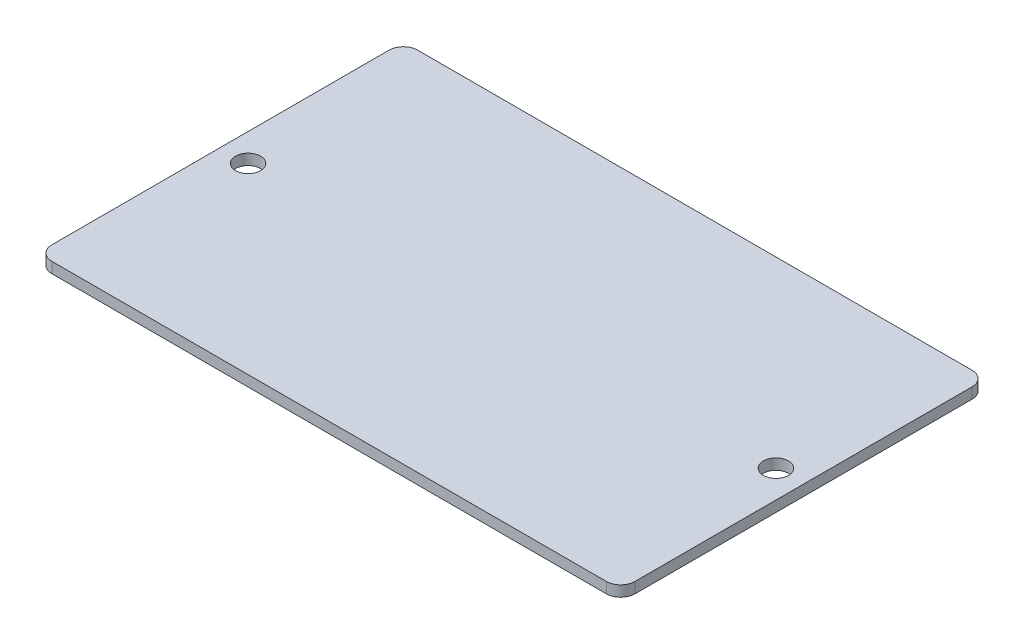
ISO-10303-21;
HEADER;
FILE_DESCRIPTION(('STEP AP214'),'2;1');
FILE_NAME('part.step','',(''),(''),'','','');
FILE_SCHEMA(('AUTOMOTIVE_DESIGN { 1 0 10303 214 1 1 1 1 }'));
ENDSEC;
DATA;
#1=APPLICATION_CONTEXT('core data for automotive mechanical design processes');
#2=APPLICATION_PROTOCOL_DEFINITION('international standard','automotive_design',2000,#1);
#3=PRODUCT_CONTEXT('',#1,'mechanical');
#4=PRODUCT('Part','Part','',(#3));
#5=PRODUCT_RELATED_PRODUCT_CATEGORY('part','',(#4));
#6=PRODUCT_DEFINITION_FORMATION('','',#4);
#7=PRODUCT_DEFINITION_CONTEXT('part definition',#1,'design');
#8=PRODUCT_DEFINITION('design','',#6,#7);
#9=PRODUCT_DEFINITION_SHAPE('','',#8);
#10=(LENGTH_UNIT() NAMED_UNIT(*) SI_UNIT(.MILLI.,.METRE.));
#11=(NAMED_UNIT(*) PLANE_ANGLE_UNIT() SI_UNIT($,.RADIAN.));
#12=(NAMED_UNIT(*) SI_UNIT($,.STERADIAN.) SOLID_ANGLE_UNIT());
#13=UNCERTAINTY_MEASURE_WITH_UNIT(LENGTH_MEASURE(1.E-05),#10,'distance_accuracy_value','');
#14=(GEOMETRIC_REPRESENTATION_CONTEXT(3) GLOBAL_UNCERTAINTY_ASSIGNED_CONTEXT((#13)) GLOBAL_UNIT_ASSIGNED_CONTEXT((#10,
#11,#12)) REPRESENTATION_CONTEXT('',''));
#15=CARTESIAN_POINT('',(0.,0.,0.));
#16=DIRECTION('',(0.,0.,1.));
#17=DIRECTION('',(1.,0.,0.));
#18=AXIS2_PLACEMENT_3D('',#15,#16,#17);
#19=CARTESIAN_POINT('',(0.,1.5,-51.));
#20=DIRECTION('',(1.,0.,0.));
#21=DIRECTION('',(0.,0.,-1.));
#22=AXIS2_PLACEMENT_3D('',#19,#20,#21);
#23=PLANE('',#22);
#24=DIRECTION('',(0.,0.,1.));
#25=VECTOR('',#24,1.);
#26=CARTESIAN_POINT('',(0.,1.5,-51.));
#27=LINE('',#26,#25);
#28=CARTESIAN_POINT('',(0.,1.5,-49.));
#29=VERTEX_POINT('',#28);
#30=CARTESIAN_POINT('',(0.,1.5,-2.));
#31=VERTEX_POINT('',#30);
#32=EDGE_CURVE('E128',#29,#31,#27,.T.);
#33=ORIENTED_EDGE('',*,*,#32,.F.);
#34=DIRECTION('',(0.,-1.,0.));
#35=VECTOR('',#34,1.);
#36=CARTESIAN_POINT('',(0.,1.5,-49.));
#37=LINE('',#36,#35);
#38=CARTESIAN_POINT('',(0.,0.,-49.));
#39=VERTEX_POINT('',#38);
#40=EDGE_CURVE('E154',#29,#39,#37,.T.);
#41=ORIENTED_EDGE('',*,*,#40,.T.);
#42=DIRECTION('',(0.,0.,1.));
#43=VECTOR('',#42,1.);
#44=CARTESIAN_POINT('',(0.,0.,-51.));
#45=LINE('',#44,#43);
#46=CARTESIAN_POINT('',(0.,0.,-2.));
#47=VERTEX_POINT('',#46);
#48=EDGE_CURVE('E162',#39,#47,#45,.T.);
#49=ORIENTED_EDGE('',*,*,#48,.T.);
#50=DIRECTION('',(0.,-1.,0.));
#51=VECTOR('',#50,1.);
#52=CARTESIAN_POINT('',(0.,1.5,-2.));
#53=LINE('',#52,#51);
#54=EDGE_CURVE('E152',#47,#31,#53,.F.);
#55=ORIENTED_EDGE('',*,*,#54,.T.);
#56=EDGE_LOOP('',(#33,#41,#49,#55));
#57=FACE_BOUND('',#56,.T.);
#58=ADVANCED_FACE('F37',(#57),#23,.F.);
#59=CARTESIAN_POINT('',(0.,1.5,0.));
#60=DIRECTION('',(0.,0.,-1.));
#61=DIRECTION('',(-1.,0.,0.));
#62=AXIS2_PLACEMENT_3D('',#59,#60,#61);
#63=PLANE('',#62);
#64=DIRECTION('',(1.,0.,0.));
#65=VECTOR('',#64,1.);
#66=CARTESIAN_POINT('',(0.,0.,0.));
#67=LINE('',#66,#65);
#68=CARTESIAN_POINT('',(2.,0.,0.));
#69=VERTEX_POINT('',#68);
#70=CARTESIAN_POINT('',(79.3,0.,0.));
#71=VERTEX_POINT('',#70);
#72=EDGE_CURVE('E133',#69,#71,#67,.T.);
#73=ORIENTED_EDGE('',*,*,#72,.T.);
#74=DIRECTION('',(0.,-1.,0.));
#75=VECTOR('',#74,1.);
#76=CARTESIAN_POINT('',(79.3,1.5,0.));
#77=LINE('',#76,#75);
#78=CARTESIAN_POINT('',(79.3,1.5,0.));
#79=VERTEX_POINT('',#78);
#80=EDGE_CURVE('E11',#71,#79,#77,.F.);
#81=ORIENTED_EDGE('',*,*,#80,.T.);
#82=DIRECTION('',(1.,0.,0.));
#83=VECTOR('',#82,1.);
#84=CARTESIAN_POINT('',(0.,1.5,0.));
#85=LINE('',#84,#83);
#86=CARTESIAN_POINT('',(2.,1.5,0.));
#87=VERTEX_POINT('',#86);
#88=EDGE_CURVE('E131',#87,#79,#85,.T.);
#89=ORIENTED_EDGE('',*,*,#88,.F.);
#90=DIRECTION('',(0.,-1.,0.));
#91=VECTOR('',#90,1.);
#92=CARTESIAN_POINT('',(2.,1.5,0.));
#93=LINE('',#92,#91);
#94=EDGE_CURVE('E45',#87,#69,#93,.T.);
#95=ORIENTED_EDGE('',*,*,#94,.T.);
#96=EDGE_LOOP('',(#73,#81,#89,#95));
#97=FACE_BOUND('',#96,.T.);
#98=ADVANCED_FACE('F159',(#97),#63,.F.);
#99=CARTESIAN_POINT('',(81.3,1.5,0.));
#100=DIRECTION('',(-1.,0.,0.));
#101=DIRECTION('',(0.,0.,1.));
#102=AXIS2_PLACEMENT_3D('',#99,#100,#101);
#103=PLANE('',#102);
#104=DIRECTION('',(0.,0.,-1.));
#105=VECTOR('',#104,1.);
#106=CARTESIAN_POINT('',(81.3,0.,0.));
#107=LINE('',#106,#105);
#108=CARTESIAN_POINT('',(81.3,0.,-2.));
#109=VERTEX_POINT('',#108);
#110=CARTESIAN_POINT('',(81.3,0.,-49.));
#111=VERTEX_POINT('',#110);
#112=EDGE_CURVE('E129',#109,#111,#107,.T.);
#113=ORIENTED_EDGE('',*,*,#112,.T.);
#114=DIRECTION('',(0.,-1.,0.));
#115=VECTOR('',#114,1.);
#116=CARTESIAN_POINT('',(81.3,1.5,-49.));
#117=LINE('',#116,#115);
#118=CARTESIAN_POINT('',(81.3,1.5,-49.));
#119=VERTEX_POINT('',#118);
#120=EDGE_CURVE('E107',#111,#119,#117,.F.);
#121=ORIENTED_EDGE('',*,*,#120,.T.);
#122=DIRECTION('',(0.,0.,-1.));
#123=VECTOR('',#122,1.);
#124=CARTESIAN_POINT('',(81.3,1.5,0.));
#125=LINE('',#124,#123);
#126=CARTESIAN_POINT('',(81.3,1.5,-2.));
#127=VERTEX_POINT('',#126);
#128=EDGE_CURVE('E167',#127,#119,#125,.T.);
#129=ORIENTED_EDGE('',*,*,#128,.F.);
#130=DIRECTION('',(0.,-1.,0.));
#131=VECTOR('',#130,1.);
#132=CARTESIAN_POINT('',(81.3,1.5,-2.));
#133=LINE('',#132,#131);
#134=EDGE_CURVE('E112',#127,#109,#133,.T.);
#135=ORIENTED_EDGE('',*,*,#134,.T.);
#136=EDGE_LOOP('',(#113,#121,#129,#135));
#137=FACE_BOUND('',#136,.T.);
#138=ADVANCED_FACE('F201',(#137),#103,.F.);
#139=CARTESIAN_POINT('',(81.3,1.5,-51.));
#140=DIRECTION('',(0.,0.,1.));
#141=DIRECTION('',(1.,0.,0.));
#142=AXIS2_PLACEMENT_3D('',#139,#140,#141);
#143=PLANE('',#142);
#144=DIRECTION('',(-1.,0.,0.));
#145=VECTOR('',#144,1.);
#146=CARTESIAN_POINT('',(81.3,1.5,-51.));
#147=LINE('',#146,#145);
#148=CARTESIAN_POINT('',(79.3,1.5,-51.));
#149=VERTEX_POINT('',#148);
#150=CARTESIAN_POINT('',(2.,1.5,-51.));
#151=VERTEX_POINT('',#150);
#152=EDGE_CURVE('E122',#149,#151,#147,.T.);
#153=ORIENTED_EDGE('',*,*,#152,.F.);
#154=DIRECTION('',(0.,-1.,0.));
#155=VECTOR('',#154,1.);
#156=CARTESIAN_POINT('',(79.3,1.5,-51.));
#157=LINE('',#156,#155);
#158=CARTESIAN_POINT('',(79.3,0.,-51.));
#159=VERTEX_POINT('',#158);
#160=EDGE_CURVE('E106',#149,#159,#157,.T.);
#161=ORIENTED_EDGE('',*,*,#160,.T.);
#162=DIRECTION('',(-1.,0.,0.));
#163=VECTOR('',#162,1.);
#164=CARTESIAN_POINT('',(81.3,0.,-51.));
#165=LINE('',#164,#163);
#166=CARTESIAN_POINT('',(2.,0.,-51.));
#167=VERTEX_POINT('',#166);
#168=EDGE_CURVE('E119',#159,#167,#165,.T.);
#169=ORIENTED_EDGE('',*,*,#168,.T.);
#170=DIRECTION('',(0.,-1.,0.));
#171=VECTOR('',#170,1.);
#172=CARTESIAN_POINT('',(2.,1.5,-51.));
#173=LINE('',#172,#171);
#174=EDGE_CURVE('E124',#167,#151,#173,.F.);
#175=ORIENTED_EDGE('',*,*,#174,.T.);
#176=EDGE_LOOP('',(#153,#161,#169,#175));
#177=FACE_BOUND('',#176,.T.);
#178=ADVANCED_FACE('F118',(#177),#143,.F.);
#179=CARTESIAN_POINT('',(0.,1.5,0.));
#180=DIRECTION('',(0.,1.,0.));
#181=DIRECTION('',(0.,0.,1.));
#182=AXIS2_PLACEMENT_3D('',#179,#180,#181);
#183=PLANE('',#182);
#184=CARTESIAN_POINT('',(3.85,1.5,-25.5));
#185=DIRECTION('',(0.,1.,0.));
#186=DIRECTION('',(0.,0.,1.));
#187=AXIS2_PLACEMENT_3D('',#184,#185,#186);
#188=CIRCLE('',#187,1.75);
#189=CARTESIAN_POINT('',(3.85,1.5,-23.75));
#190=VERTEX_POINT('',#189);
#191=EDGE_CURVE('E163',#190,#190,#188,.T.);
#192=ORIENTED_EDGE('',*,*,#191,.F.);
#193=EDGE_LOOP('',(#192));
#194=FACE_BOUND('',#193,.T.);
#195=CARTESIAN_POINT('',(77.45,1.5,-25.5));
#196=DIRECTION('',(0.,1.,0.));
#197=DIRECTION('',(0.,0.,1.));
#198=AXIS2_PLACEMENT_3D('',#195,#196,#197);
#199=CIRCLE('',#198,1.75000000000001);
#200=CARTESIAN_POINT('',(77.45,1.5,-23.75));
#201=VERTEX_POINT('',#200);
#202=EDGE_CURVE('E173',#201,#201,#199,.T.);
#203=ORIENTED_EDGE('',*,*,#202,.F.);
#204=EDGE_LOOP('',(#203));
#205=FACE_BOUND('',#204,.T.);
#206=ORIENTED_EDGE('',*,*,#128,.T.);
#207=CARTESIAN_POINT('',(79.3,1.5,-49.));
#208=DIRECTION('',(0.,1.,0.));
#209=DIRECTION('',(0.,0.,1.));
#210=AXIS2_PLACEMENT_3D('',#207,#208,#209);
#211=CIRCLE('',#210,2.);
#212=EDGE_CURVE('E150',#119,#149,#211,.T.);
#213=ORIENTED_EDGE('',*,*,#212,.T.);
#214=ORIENTED_EDGE('',*,*,#152,.T.);
#215=CARTESIAN_POINT('',(2.,1.5,-49.));
#216=DIRECTION('',(0.,1.,0.));
#217=DIRECTION('',(0.,0.,1.));
#218=AXIS2_PLACEMENT_3D('',#215,#216,#217);
#219=CIRCLE('',#218,2.);
#220=EDGE_CURVE('E148',#151,#29,#219,.T.);
#221=ORIENTED_EDGE('',*,*,#220,.T.);
#222=ORIENTED_EDGE('',*,*,#32,.T.);
#223=CARTESIAN_POINT('',(2.,1.5,-2.));
#224=DIRECTION('',(0.,1.,0.));
#225=DIRECTION('',(0.,0.,1.));
#226=AXIS2_PLACEMENT_3D('',#223,#224,#225);
#227=CIRCLE('',#226,2.);
#228=EDGE_CURVE('E57',#31,#87,#227,.T.);
#229=ORIENTED_EDGE('',*,*,#228,.T.);
#230=ORIENTED_EDGE('',*,*,#88,.T.);
#231=CARTESIAN_POINT('',(79.3,1.5,-2.));
#232=DIRECTION('',(0.,1.,0.));
#233=DIRECTION('',(0.,0.,1.));
#234=AXIS2_PLACEMENT_3D('',#231,#232,#233);
#235=CIRCLE('',#234,2.);
#236=EDGE_CURVE('E146',#79,#127,#235,.T.);
#237=ORIENTED_EDGE('',*,*,#236,.T.);
#238=EDGE_LOOP('',(#206,#213,#214,#221,#222,#229,#230,#237));
#239=FACE_BOUND('',#238,.T.);
#240=ADVANCED_FACE('F220',(#194,#205,#239),#183,.T.);
#241=CARTESIAN_POINT('',(0.,0.,0.));
#242=DIRECTION('',(0.,1.,0.));
#243=DIRECTION('',(0.,0.,1.));
#244=AXIS2_PLACEMENT_3D('',#241,#242,#243);
#245=PLANE('',#244);
#246=CARTESIAN_POINT('',(3.85,0.,-25.5));
#247=DIRECTION('',(0.,1.,0.));
#248=DIRECTION('',(0.,0.,1.));
#249=AXIS2_PLACEMENT_3D('',#246,#247,#248);
#250=CIRCLE('',#249,1.75);
#251=CARTESIAN_POINT('',(3.85,0.,-23.75));
#252=VERTEX_POINT('',#251);
#253=EDGE_CURVE('E176',#252,#252,#250,.T.);
#254=ORIENTED_EDGE('',*,*,#253,.T.);
#255=EDGE_LOOP('',(#254));
#256=FACE_BOUND('',#255,.T.);
#257=CARTESIAN_POINT('',(77.45,0.,-25.5));
#258=DIRECTION('',(0.,1.,0.));
#259=DIRECTION('',(0.,0.,-1.));
#260=AXIS2_PLACEMENT_3D('',#257,#258,#259);
#261=CIRCLE('',#260,1.75000000000001);
#262=CARTESIAN_POINT('',(77.45,0.,-27.25));
#263=VERTEX_POINT('',#262);
#264=EDGE_CURVE('E177',#263,#263,#261,.T.);
#265=ORIENTED_EDGE('',*,*,#264,.T.);
#266=EDGE_LOOP('',(#265));
#267=FACE_BOUND('',#266,.T.);
#268=ORIENTED_EDGE('',*,*,#168,.F.);
#269=CARTESIAN_POINT('',(79.3,0.,-49.));
#270=DIRECTION('',(0.,1.,0.));
#271=DIRECTION('',(0.,0.,1.));
#272=AXIS2_PLACEMENT_3D('',#269,#270,#271);
#273=CIRCLE('',#272,2.);
#274=EDGE_CURVE('E102',#159,#111,#273,.F.);
#275=ORIENTED_EDGE('',*,*,#274,.T.);
#276=ORIENTED_EDGE('',*,*,#112,.F.);
#277=CARTESIAN_POINT('',(79.3,0.,-2.));
#278=DIRECTION('',(0.,1.,0.));
#279=DIRECTION('',(0.,0.,1.));
#280=AXIS2_PLACEMENT_3D('',#277,#278,#279);
#281=CIRCLE('',#280,2.);
#282=EDGE_CURVE('E139',#109,#71,#281,.F.);
#283=ORIENTED_EDGE('',*,*,#282,.T.);
#284=ORIENTED_EDGE('',*,*,#72,.F.);
#285=CARTESIAN_POINT('',(2.,0.,-2.));
#286=DIRECTION('',(0.,1.,0.));
#287=DIRECTION('',(0.,0.,1.));
#288=AXIS2_PLACEMENT_3D('',#285,#286,#287);
#289=CIRCLE('',#288,2.);
#290=EDGE_CURVE('E123',#69,#47,#289,.F.);
#291=ORIENTED_EDGE('',*,*,#290,.T.);
#292=ORIENTED_EDGE('',*,*,#48,.F.);
#293=CARTESIAN_POINT('',(2.,0.,-49.));
#294=DIRECTION('',(0.,1.,0.));
#295=DIRECTION('',(0.,0.,1.));
#296=AXIS2_PLACEMENT_3D('',#293,#294,#295);
#297=CIRCLE('',#296,2.);
#298=EDGE_CURVE('E113',#39,#167,#297,.F.);
#299=ORIENTED_EDGE('',*,*,#298,.T.);
#300=EDGE_LOOP('',(#268,#275,#276,#283,#284,#291,#292,#299));
#301=FACE_BOUND('',#300,.T.);
#302=ADVANCED_FACE('F126',(#256,#267,#301),#245,.F.);
#303=CARTESIAN_POINT('',(79.3,1.5,-49.));
#304=DIRECTION('',(0.,-1.,0.));
#305=DIRECTION('',(0.,0.,-1.));
#306=AXIS2_PLACEMENT_3D('',#303,#304,#305);
#307=CYLINDRICAL_SURFACE('',#306,2.);
#308=ORIENTED_EDGE('',*,*,#212,.F.);
#309=ORIENTED_EDGE('',*,*,#120,.F.);
#310=ORIENTED_EDGE('',*,*,#274,.F.);
#311=ORIENTED_EDGE('',*,*,#160,.F.);
#312=EDGE_LOOP('',(#308,#309,#310,#311));
#313=FACE_BOUND('',#312,.T.);
#314=ADVANCED_FACE('F105',(#313),#307,.T.);
#315=CARTESIAN_POINT('',(2.,1.5,-49.));
#316=DIRECTION('',(0.,-1.,0.));
#317=DIRECTION('',(0.,0.,-1.));
#318=AXIS2_PLACEMENT_3D('',#315,#316,#317);
#319=CYLINDRICAL_SURFACE('',#318,2.);
#320=ORIENTED_EDGE('',*,*,#220,.F.);
#321=ORIENTED_EDGE('',*,*,#174,.F.);
#322=ORIENTED_EDGE('',*,*,#298,.F.);
#323=ORIENTED_EDGE('',*,*,#40,.F.);
#324=EDGE_LOOP('',(#320,#321,#322,#323));
#325=FACE_BOUND('',#324,.T.);
#326=ADVANCED_FACE('F208',(#325),#319,.T.);
#327=CARTESIAN_POINT('',(79.3,1.5,-2.));
#328=DIRECTION('',(0.,-1.,0.));
#329=DIRECTION('',(0.,0.,-1.));
#330=AXIS2_PLACEMENT_3D('',#327,#328,#329);
#331=CYLINDRICAL_SURFACE('',#330,2.);
#332=ORIENTED_EDGE('',*,*,#236,.F.);
#333=ORIENTED_EDGE('',*,*,#80,.F.);
#334=ORIENTED_EDGE('',*,*,#282,.F.);
#335=ORIENTED_EDGE('',*,*,#134,.F.);
#336=EDGE_LOOP('',(#332,#333,#334,#335));
#337=FACE_BOUND('',#336,.T.);
#338=ADVANCED_FACE('F210',(#337),#331,.T.);
#339=CARTESIAN_POINT('',(2.,1.5,-2.));
#340=DIRECTION('',(0.,-1.,0.));
#341=DIRECTION('',(0.,0.,-1.));
#342=AXIS2_PLACEMENT_3D('',#339,#340,#341);
#343=CYLINDRICAL_SURFACE('',#342,2.);
#344=ORIENTED_EDGE('',*,*,#228,.F.);
#345=ORIENTED_EDGE('',*,*,#54,.F.);
#346=ORIENTED_EDGE('',*,*,#290,.F.);
#347=ORIENTED_EDGE('',*,*,#94,.F.);
#348=EDGE_LOOP('',(#344,#345,#346,#347));
#349=FACE_BOUND('',#348,.T.);
#350=ADVANCED_FACE('F39',(#349),#343,.T.);
#351=CARTESIAN_POINT('',(77.45,0.,-25.5));
#352=DIRECTION('',(0.,1.,0.));
#353=DIRECTION('',(0.,0.,1.));
#354=AXIS2_PLACEMENT_3D('',#351,#352,#353);
#355=CYLINDRICAL_SURFACE('',#354,1.75000000000001);
#356=ORIENTED_EDGE('',*,*,#202,.T.);
#357=EDGE_LOOP('',(#356));
#358=FACE_BOUND('',#357,.T.);
#359=ORIENTED_EDGE('',*,*,#264,.F.);
#360=EDGE_LOOP('',(#359));
#361=FACE_BOUND('',#360,.T.);
#362=ADVANCED_FACE('F187',(#358,#361),#355,.F.);
#363=CARTESIAN_POINT('',(3.85,0.,-25.5));
#364=DIRECTION('',(0.,1.,0.));
#365=DIRECTION('',(0.,0.,1.));
#366=AXIS2_PLACEMENT_3D('',#363,#364,#365);
#367=CYLINDRICAL_SURFACE('',#366,1.75);
#368=ORIENTED_EDGE('',*,*,#191,.T.);
#369=EDGE_LOOP('',(#368));
#370=FACE_BOUND('',#369,.T.);
#371=ORIENTED_EDGE('',*,*,#253,.F.);
#372=EDGE_LOOP('',(#371));
#373=FACE_BOUND('',#372,.T.);
#374=ADVANCED_FACE('F185',(#370,#373),#367,.F.);
#375=CLOSED_SHELL('',(#58,#98,#138,#178,#240,#302,#314,#326,#338,#350,#362,#374));
#376=MANIFOLD_SOLID_BREP('B2',#375);
#377=ADVANCED_BREP_SHAPE_REPRESENTATION('',(#18,#376),#14);
#378=SHAPE_DEFINITION_REPRESENTATION(#9,#377);
ENDSEC;
END-ISO-10303-21;
